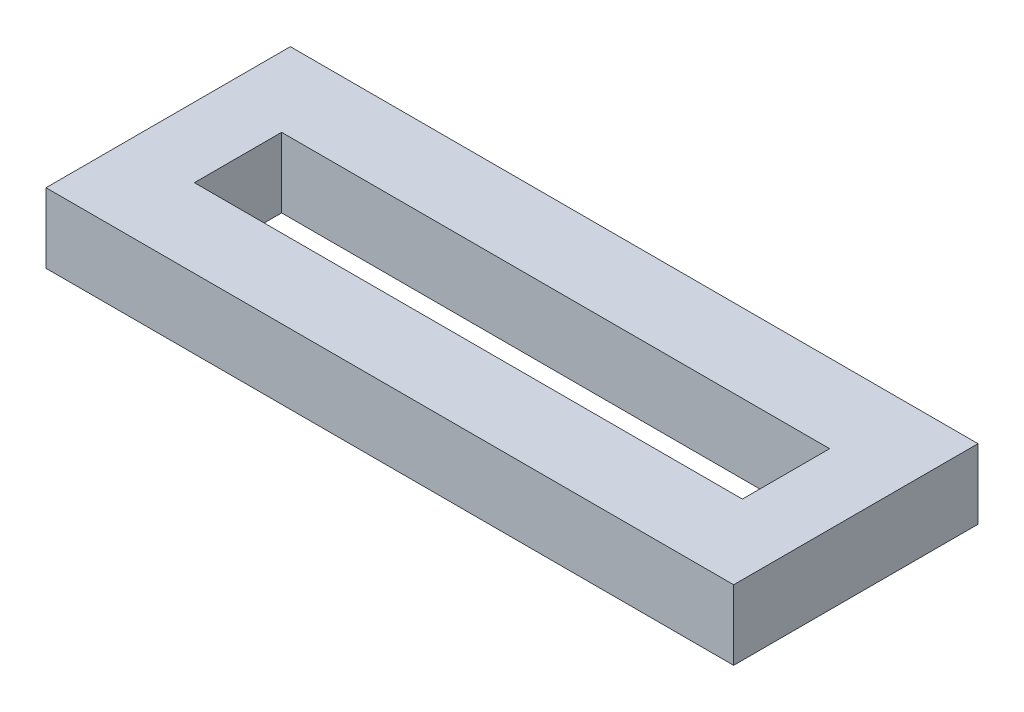
ISO-10303-21;
HEADER;
FILE_DESCRIPTION(('STEP AP214'),'2;1');
FILE_NAME('part.step','',(''),(''),'','','');
FILE_SCHEMA(('AUTOMOTIVE_DESIGN { 1 0 10303 214 1 1 1 1 }'));
ENDSEC;
DATA;
#1=APPLICATION_CONTEXT('core data for automotive mechanical design processes');
#2=APPLICATION_PROTOCOL_DEFINITION('international standard','automotive_design',2000,#1);
#3=PRODUCT_CONTEXT('',#1,'mechanical');
#4=PRODUCT('Part','Part','',(#3));
#5=PRODUCT_RELATED_PRODUCT_CATEGORY('part','',(#4));
#6=PRODUCT_DEFINITION_FORMATION('','',#4);
#7=PRODUCT_DEFINITION_CONTEXT('part definition',#1,'design');
#8=PRODUCT_DEFINITION('design','',#6,#7);
#9=PRODUCT_DEFINITION_SHAPE('','',#8);
#10=(LENGTH_UNIT() NAMED_UNIT(*) SI_UNIT(.MILLI.,.METRE.));
#11=(NAMED_UNIT(*) PLANE_ANGLE_UNIT() SI_UNIT($,.RADIAN.));
#12=(NAMED_UNIT(*) SI_UNIT($,.STERADIAN.) SOLID_ANGLE_UNIT());
#13=UNCERTAINTY_MEASURE_WITH_UNIT(LENGTH_MEASURE(1.E-05),#10,'distance_accuracy_value','');
#14=(GEOMETRIC_REPRESENTATION_CONTEXT(3) GLOBAL_UNCERTAINTY_ASSIGNED_CONTEXT((#13)) GLOBAL_UNIT_ASSIGNED_CONTEXT((#10,
#11,#12)) REPRESENTATION_CONTEXT('',''));
#15=CARTESIAN_POINT('',(0.,0.,0.));
#16=DIRECTION('',(0.,0.,1.));
#17=DIRECTION('',(1.,0.,0.));
#18=AXIS2_PLACEMENT_3D('',#15,#16,#17);
#19=CARTESIAN_POINT('',(0.,4.,0.));
#20=DIRECTION('',(0.,-1.,0.));
#21=DIRECTION('',(0.,0.,-1.));
#22=AXIS2_PLACEMENT_3D('',#19,#20,#21);
#23=PLANE('',#22);
#24=DIRECTION('',(0.,0.,-1.));
#25=VECTOR('',#24,1.);
#26=CARTESIAN_POINT('',(0.,4.,0.));
#27=LINE('',#26,#25);
#28=CARTESIAN_POINT('',(0.,4.,14.));
#29=VERTEX_POINT('',#28);
#30=CARTESIAN_POINT('',(0.,4.,0.));
#31=VERTEX_POINT('',#30);
#32=EDGE_CURVE('E153',#29,#31,#27,.T.);
#33=ORIENTED_EDGE('',*,*,#32,.T.);
#34=DIRECTION('',(-1.,0.,0.));
#35=VECTOR('',#34,1.);
#36=CARTESIAN_POINT('',(0.,4.,0.));
#37=LINE('',#36,#35);
#38=CARTESIAN_POINT('',(-39.4,4.,0.));
#39=VERTEX_POINT('',#38);
#40=EDGE_CURVE('E157',#31,#39,#37,.T.);
#41=ORIENTED_EDGE('',*,*,#40,.T.);
#42=DIRECTION('',(0.,0.,1.));
#43=VECTOR('',#42,1.);
#44=CARTESIAN_POINT('',(-39.4,4.,0.));
#45=LINE('',#44,#43);
#46=CARTESIAN_POINT('',(-39.4,4.,14.));
#47=VERTEX_POINT('',#46);
#48=EDGE_CURVE('E161',#39,#47,#45,.T.);
#49=ORIENTED_EDGE('',*,*,#48,.T.);
#50=DIRECTION('',(1.,0.,0.));
#51=VECTOR('',#50,1.);
#52=CARTESIAN_POINT('',(0.,4.,14.));
#53=LINE('',#52,#51);
#54=EDGE_CURVE('E164',#47,#29,#53,.T.);
#55=ORIENTED_EDGE('',*,*,#54,.T.);
#56=EDGE_LOOP('',(#33,#41,#49,#55));
#57=FACE_BOUND('',#56,.T.);
#58=DIRECTION('',(0.,0.,-1.));
#59=VECTOR('',#58,1.);
#60=CARTESIAN_POINT('',(-4.,4.,4.5));
#61=LINE('',#60,#59);
#62=CARTESIAN_POINT('',(-4.,4.,9.5));
#63=VERTEX_POINT('',#62);
#64=CARTESIAN_POINT('',(-4.,4.,4.5));
#65=VERTEX_POINT('',#64);
#66=EDGE_CURVE('E105',#63,#65,#61,.T.);
#67=ORIENTED_EDGE('',*,*,#66,.F.);
#68=DIRECTION('',(1.,0.,0.));
#69=VECTOR('',#68,1.);
#70=CARTESIAN_POINT('',(-4.,4.,9.5));
#71=LINE('',#70,#69);
#72=CARTESIAN_POINT('',(-35.4,4.,9.5));
#73=VERTEX_POINT('',#72);
#74=EDGE_CURVE('E131',#73,#63,#71,.T.);
#75=ORIENTED_EDGE('',*,*,#74,.F.);
#76=DIRECTION('',(0.,0.,1.));
#77=VECTOR('',#76,1.);
#78=CARTESIAN_POINT('',(-35.4,4.,4.5));
#79=LINE('',#78,#77);
#80=CARTESIAN_POINT('',(-35.4,4.,4.5));
#81=VERTEX_POINT('',#80);
#82=EDGE_CURVE('E127',#81,#73,#79,.T.);
#83=ORIENTED_EDGE('',*,*,#82,.F.);
#84=DIRECTION('',(-1.,0.,0.));
#85=VECTOR('',#84,1.);
#86=CARTESIAN_POINT('',(-4.,4.,4.5));
#87=LINE('',#86,#85);
#88=EDGE_CURVE('E114',#65,#81,#87,.T.);
#89=ORIENTED_EDGE('',*,*,#88,.F.);
#90=EDGE_LOOP('',(#67,#75,#83,#89));
#91=FACE_BOUND('',#90,.T.);
#92=ADVANCED_FACE('F39',(#57,#91),#23,.F.);
#93=CARTESIAN_POINT('',(0.,0.,0.));
#94=DIRECTION('',(0.,-1.,0.));
#95=DIRECTION('',(0.,0.,-1.));
#96=AXIS2_PLACEMENT_3D('',#93,#94,#95);
#97=PLANE('',#96);
#98=DIRECTION('',(0.,0.,-1.));
#99=VECTOR('',#98,1.);
#100=CARTESIAN_POINT('',(0.,0.,0.));
#101=LINE('',#100,#99);
#102=CARTESIAN_POINT('',(0.,0.,14.));
#103=VERTEX_POINT('',#102);
#104=CARTESIAN_POINT('',(0.,0.,0.));
#105=VERTEX_POINT('',#104);
#106=EDGE_CURVE('E123',#103,#105,#101,.T.);
#107=ORIENTED_EDGE('',*,*,#106,.F.);
#108=DIRECTION('',(1.,0.,0.));
#109=VECTOR('',#108,1.);
#110=CARTESIAN_POINT('',(0.,0.,14.));
#111=LINE('',#110,#109);
#112=CARTESIAN_POINT('',(-39.4,0.,14.));
#113=VERTEX_POINT('',#112);
#114=EDGE_CURVE('E158',#113,#103,#111,.T.);
#115=ORIENTED_EDGE('',*,*,#114,.F.);
#116=DIRECTION('',(0.,0.,1.));
#117=VECTOR('',#116,1.);
#118=CARTESIAN_POINT('',(-39.4,0.,0.));
#119=LINE('',#118,#117);
#120=CARTESIAN_POINT('',(-39.4,0.,0.));
#121=VERTEX_POINT('',#120);
#122=EDGE_CURVE('E174',#121,#113,#119,.T.);
#123=ORIENTED_EDGE('',*,*,#122,.F.);
#124=DIRECTION('',(-1.,0.,0.));
#125=VECTOR('',#124,1.);
#126=CARTESIAN_POINT('',(0.,0.,0.));
#127=LINE('',#126,#125);
#128=EDGE_CURVE('E171',#105,#121,#127,.T.);
#129=ORIENTED_EDGE('',*,*,#128,.F.);
#130=EDGE_LOOP('',(#107,#115,#123,#129));
#131=FACE_BOUND('',#130,.T.);
#132=DIRECTION('',(1.,0.,0.));
#133=VECTOR('',#132,1.);
#134=CARTESIAN_POINT('',(-4.,0.,9.5));
#135=LINE('',#134,#133);
#136=CARTESIAN_POINT('',(-35.4,0.,9.5));
#137=VERTEX_POINT('',#136);
#138=CARTESIAN_POINT('',(-4.,0.,9.5));
#139=VERTEX_POINT('',#138);
#140=EDGE_CURVE('E115',#137,#139,#135,.T.);
#141=ORIENTED_EDGE('',*,*,#140,.T.);
#142=DIRECTION('',(0.,0.,-1.));
#143=VECTOR('',#142,1.);
#144=CARTESIAN_POINT('',(-4.,0.,4.5));
#145=LINE('',#144,#143);
#146=CARTESIAN_POINT('',(-4.,0.,4.5));
#147=VERTEX_POINT('',#146);
#148=EDGE_CURVE('E63',#139,#147,#145,.T.);
#149=ORIENTED_EDGE('',*,*,#148,.T.);
#150=DIRECTION('',(-1.,0.,0.));
#151=VECTOR('',#150,1.);
#152=CARTESIAN_POINT('',(-4.,0.,4.5));
#153=LINE('',#152,#151);
#154=CARTESIAN_POINT('',(-35.4,0.,4.5));
#155=VERTEX_POINT('',#154);
#156=EDGE_CURVE('E121',#147,#155,#153,.T.);
#157=ORIENTED_EDGE('',*,*,#156,.T.);
#158=DIRECTION('',(0.,0.,1.));
#159=VECTOR('',#158,1.);
#160=CARTESIAN_POINT('',(-35.4,0.,4.5));
#161=LINE('',#160,#159);
#162=EDGE_CURVE('E140',#155,#137,#161,.T.);
#163=ORIENTED_EDGE('',*,*,#162,.T.);
#164=EDGE_LOOP('',(#141,#149,#157,#163));
#165=FACE_BOUND('',#164,.T.);
#166=ADVANCED_FACE('F197',(#131,#165),#97,.T.);
#167=CARTESIAN_POINT('',(0.,4.,0.));
#168=DIRECTION('',(-1.,0.,0.));
#169=DIRECTION('',(0.,0.,1.));
#170=AXIS2_PLACEMENT_3D('',#167,#168,#169);
#171=PLANE('',#170);
#172=ORIENTED_EDGE('',*,*,#106,.T.);
#173=DIRECTION('',(0.,-1.,0.));
#174=VECTOR('',#173,1.);
#175=CARTESIAN_POINT('',(0.,4.,0.));
#176=LINE('',#175,#174);
#177=EDGE_CURVE('E11',#31,#105,#176,.T.);
#178=ORIENTED_EDGE('',*,*,#177,.F.);
#179=ORIENTED_EDGE('',*,*,#32,.F.);
#180=DIRECTION('',(0.,-1.,0.));
#181=VECTOR('',#180,1.);
#182=CARTESIAN_POINT('',(0.,4.,14.));
#183=LINE('',#182,#181);
#184=EDGE_CURVE('E167',#29,#103,#183,.T.);
#185=ORIENTED_EDGE('',*,*,#184,.T.);
#186=EDGE_LOOP('',(#172,#178,#179,#185));
#187=FACE_BOUND('',#186,.T.);
#188=ADVANCED_FACE('F41',(#187),#171,.F.);
#189=CARTESIAN_POINT('',(0.,4.,0.));
#190=DIRECTION('',(0.,0.,1.));
#191=DIRECTION('',(1.,0.,0.));
#192=AXIS2_PLACEMENT_3D('',#189,#190,#191);
#193=PLANE('',#192);
#194=ORIENTED_EDGE('',*,*,#128,.T.);
#195=DIRECTION('',(0.,-1.,0.));
#196=VECTOR('',#195,1.);
#197=CARTESIAN_POINT('',(-39.4,4.,0.));
#198=LINE('',#197,#196);
#199=EDGE_CURVE('E48',#39,#121,#198,.T.);
#200=ORIENTED_EDGE('',*,*,#199,.F.);
#201=ORIENTED_EDGE('',*,*,#40,.F.);
#202=ORIENTED_EDGE('',*,*,#177,.T.);
#203=EDGE_LOOP('',(#194,#200,#201,#202));
#204=FACE_BOUND('',#203,.T.);
#205=ADVANCED_FACE('F207',(#204),#193,.F.);
#206=CARTESIAN_POINT('',(-39.4,4.,0.));
#207=DIRECTION('',(1.,0.,0.));
#208=DIRECTION('',(0.,0.,-1.));
#209=AXIS2_PLACEMENT_3D('',#206,#207,#208);
#210=PLANE('',#209);
#211=ORIENTED_EDGE('',*,*,#122,.T.);
#212=DIRECTION('',(0.,-1.,0.));
#213=VECTOR('',#212,1.);
#214=CARTESIAN_POINT('',(-39.4,4.,14.));
#215=LINE('',#214,#213);
#216=EDGE_CURVE('E182',#47,#113,#215,.T.);
#217=ORIENTED_EDGE('',*,*,#216,.F.);
#218=ORIENTED_EDGE('',*,*,#48,.F.);
#219=ORIENTED_EDGE('',*,*,#199,.T.);
#220=EDGE_LOOP('',(#211,#217,#218,#219));
#221=FACE_BOUND('',#220,.T.);
#222=ADVANCED_FACE('F191',(#221),#210,.F.);
#223=CARTESIAN_POINT('',(0.,4.,14.));
#224=DIRECTION('',(0.,0.,-1.));
#225=DIRECTION('',(-1.,0.,0.));
#226=AXIS2_PLACEMENT_3D('',#223,#224,#225);
#227=PLANE('',#226);
#228=ORIENTED_EDGE('',*,*,#114,.T.);
#229=ORIENTED_EDGE('',*,*,#184,.F.);
#230=ORIENTED_EDGE('',*,*,#54,.F.);
#231=ORIENTED_EDGE('',*,*,#216,.T.);
#232=EDGE_LOOP('',(#228,#229,#230,#231));
#233=FACE_BOUND('',#232,.T.);
#234=ADVANCED_FACE('F201',(#233),#227,.F.);
#235=CARTESIAN_POINT('',(-4.,4.,4.5));
#236=DIRECTION('',(-1.,0.,0.));
#237=DIRECTION('',(0.,0.,1.));
#238=AXIS2_PLACEMENT_3D('',#235,#236,#237);
#239=PLANE('',#238);
#240=ORIENTED_EDGE('',*,*,#148,.F.);
#241=DIRECTION('',(0.,-1.,0.));
#242=VECTOR('',#241,1.);
#243=CARTESIAN_POINT('',(-4.,4.,9.5));
#244=LINE('',#243,#242);
#245=EDGE_CURVE('E109',#63,#139,#244,.T.);
#246=ORIENTED_EDGE('',*,*,#245,.F.);
#247=ORIENTED_EDGE('',*,*,#66,.T.);
#248=DIRECTION('',(0.,-1.,0.));
#249=VECTOR('',#248,1.);
#250=CARTESIAN_POINT('',(-4.,4.,4.5));
#251=LINE('',#250,#249);
#252=EDGE_CURVE('E108',#65,#147,#251,.T.);
#253=ORIENTED_EDGE('',*,*,#252,.T.);
#254=EDGE_LOOP('',(#240,#246,#247,#253));
#255=FACE_BOUND('',#254,.T.);
#256=ADVANCED_FACE('F107',(#255),#239,.T.);
#257=CARTESIAN_POINT('',(-4.,4.,4.5));
#258=DIRECTION('',(0.,0.,1.));
#259=DIRECTION('',(1.,0.,0.));
#260=AXIS2_PLACEMENT_3D('',#257,#258,#259);
#261=PLANE('',#260);
#262=ORIENTED_EDGE('',*,*,#156,.F.);
#263=ORIENTED_EDGE('',*,*,#252,.F.);
#264=ORIENTED_EDGE('',*,*,#88,.T.);
#265=DIRECTION('',(0.,-1.,0.));
#266=VECTOR('',#265,1.);
#267=CARTESIAN_POINT('',(-35.4,4.,4.5));
#268=LINE('',#267,#266);
#269=EDGE_CURVE('E124',#81,#155,#268,.T.);
#270=ORIENTED_EDGE('',*,*,#269,.T.);
#271=EDGE_LOOP('',(#262,#263,#264,#270));
#272=FACE_BOUND('',#271,.T.);
#273=ADVANCED_FACE('F118',(#272),#261,.T.);
#274=CARTESIAN_POINT('',(-35.4,4.,4.5));
#275=DIRECTION('',(1.,0.,0.));
#276=DIRECTION('',(0.,0.,-1.));
#277=AXIS2_PLACEMENT_3D('',#274,#275,#276);
#278=PLANE('',#277);
#279=ORIENTED_EDGE('',*,*,#162,.F.);
#280=ORIENTED_EDGE('',*,*,#269,.F.);
#281=ORIENTED_EDGE('',*,*,#82,.T.);
#282=DIRECTION('',(0.,-1.,0.));
#283=VECTOR('',#282,1.);
#284=CARTESIAN_POINT('',(-35.4,4.,9.5));
#285=LINE('',#284,#283);
#286=EDGE_CURVE('E55',#73,#137,#285,.T.);
#287=ORIENTED_EDGE('',*,*,#286,.T.);
#288=EDGE_LOOP('',(#279,#280,#281,#287));
#289=FACE_BOUND('',#288,.T.);
#290=ADVANCED_FACE('F230',(#289),#278,.T.);
#291=CARTESIAN_POINT('',(-4.,4.,9.5));
#292=DIRECTION('',(0.,0.,-1.));
#293=DIRECTION('',(-1.,0.,0.));
#294=AXIS2_PLACEMENT_3D('',#291,#292,#293);
#295=PLANE('',#294);
#296=ORIENTED_EDGE('',*,*,#140,.F.);
#297=ORIENTED_EDGE('',*,*,#286,.F.);
#298=ORIENTED_EDGE('',*,*,#74,.T.);
#299=ORIENTED_EDGE('',*,*,#245,.T.);
#300=EDGE_LOOP('',(#296,#297,#298,#299));
#301=FACE_BOUND('',#300,.T.);
#302=ADVANCED_FACE('F234',(#301),#295,.T.);
#303=CLOSED_SHELL('',(#92,#166,#188,#205,#222,#234,#256,#273,#290,#302));
#304=MANIFOLD_SOLID_BREP('B2',#303);
#305=ADVANCED_BREP_SHAPE_REPRESENTATION('',(#18,#304),#14);
#306=SHAPE_DEFINITION_REPRESENTATION(#9,#305);
ENDSEC;
END-ISO-10303-21;
